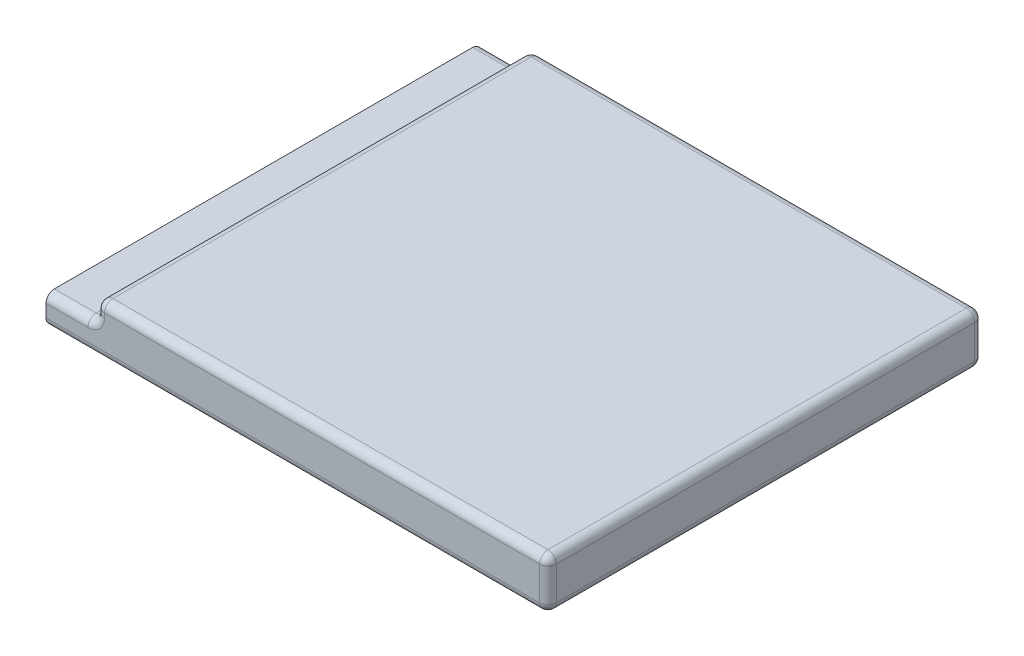
ISO-10303-21;
HEADER;
FILE_DESCRIPTION(('STEP AP214'),'2;1');
FILE_NAME('part.step','',(''),(''),'','','');
FILE_SCHEMA(('AUTOMOTIVE_DESIGN { 1 0 10303 214 1 1 1 1 }'));
ENDSEC;
DATA;
#1=APPLICATION_CONTEXT('core data for automotive mechanical design processes');
#2=APPLICATION_PROTOCOL_DEFINITION('international standard','automotive_design',2000,#1);
#3=PRODUCT_CONTEXT('',#1,'mechanical');
#4=PRODUCT('Part','Part','',(#3));
#5=PRODUCT_RELATED_PRODUCT_CATEGORY('part','',(#4));
#6=PRODUCT_DEFINITION_FORMATION('','',#4);
#7=PRODUCT_DEFINITION_CONTEXT('part definition',#1,'design');
#8=PRODUCT_DEFINITION('design','',#6,#7);
#9=PRODUCT_DEFINITION_SHAPE('','',#8);
#10=(LENGTH_UNIT() NAMED_UNIT(*) SI_UNIT(.MILLI.,.METRE.));
#11=(NAMED_UNIT(*) PLANE_ANGLE_UNIT() SI_UNIT($,.RADIAN.));
#12=(NAMED_UNIT(*) SI_UNIT($,.STERADIAN.) SOLID_ANGLE_UNIT());
#13=UNCERTAINTY_MEASURE_WITH_UNIT(LENGTH_MEASURE(1.E-05),#10,'distance_accuracy_value','');
#14=(GEOMETRIC_REPRESENTATION_CONTEXT(3) GLOBAL_UNCERTAINTY_ASSIGNED_CONTEXT((#13)) GLOBAL_UNIT_ASSIGNED_CONTEXT((#10,
#11,#12)) REPRESENTATION_CONTEXT('',''));
#15=CARTESIAN_POINT('',(0.,0.,0.));
#16=DIRECTION('',(0.,0.,1.));
#17=DIRECTION('',(1.,0.,0.));
#18=AXIS2_PLACEMENT_3D('',#15,#16,#17);
#19=CARTESIAN_POINT('',(-18.8789422844798,6.,-20.4763912470127));
#20=DIRECTION('',(1.,0.,0.));
#21=DIRECTION('',(0.,0.,-1.));
#22=AXIS2_PLACEMENT_3D('',#19,#20,#21);
#23=PLANE('',#22);
#24=DIRECTION('',(0.,-1.,0.));
#25=VECTOR('',#24,1.);
#26=CARTESIAN_POINT('',(-18.8789422844798,6.,31.5236087529873));
#27=LINE('',#26,#25);
#28=CARTESIAN_POINT('',(-18.8789422844798,2.5,31.5236087529873));
#29=VERTEX_POINT('',#28);
#30=CARTESIAN_POINT('',(-18.8789422844798,1.,31.5236087529873));
#31=VERTEX_POINT('',#30);
#32=EDGE_CURVE('E307',#29,#31,#27,.T.);
#33=ORIENTED_EDGE('',*,*,#32,.F.);
#34=CARTESIAN_POINT('',(-18.8789422844798,2.5,30.5236087529873));
#35=DIRECTION('',(1.,0.,0.));
#36=DIRECTION('',(0.,0.,-1.));
#37=AXIS2_PLACEMENT_3D('',#34,#35,#36);
#38=CIRCLE('',#37,1.);
#39=CARTESIAN_POINT('',(-18.8789422844798,3.5,30.5236087529873));
#40=VERTEX_POINT('',#39);
#41=EDGE_CURVE('E171',#29,#40,#38,.F.);
#42=ORIENTED_EDGE('',*,*,#41,.T.);
#43=DIRECTION('',(0.,0.,1.));
#44=VECTOR('',#43,1.);
#45=CARTESIAN_POINT('',(-18.8789422844798,3.5,-20.4763912470127));
#46=LINE('',#45,#44);
#47=CARTESIAN_POINT('',(-18.8789422844798,3.5,-19.4763912470127));
#48=VERTEX_POINT('',#47);
#49=EDGE_CURVE('E155',#48,#40,#46,.T.);
#50=ORIENTED_EDGE('',*,*,#49,.F.);
#51=CARTESIAN_POINT('',(-18.8789422844798,2.5,-19.4763912470127));
#52=DIRECTION('',(1.,0.,0.));
#53=DIRECTION('',(0.,0.,-1.));
#54=AXIS2_PLACEMENT_3D('',#51,#52,#53);
#55=CIRCLE('',#54,1.);
#56=CARTESIAN_POINT('',(-18.8789422844798,2.5,-20.4763912470127));
#57=VERTEX_POINT('',#56);
#58=EDGE_CURVE('E168',#48,#57,#55,.F.);
#59=ORIENTED_EDGE('',*,*,#58,.T.);
#60=DIRECTION('',(0.,-1.,0.));
#61=VECTOR('',#60,1.);
#62=CARTESIAN_POINT('',(-18.8789422844798,6.,-20.4763912470127));
#63=LINE('',#62,#61);
#64=CARTESIAN_POINT('',(-18.8789422844798,1.,-20.4763912470127));
#65=VERTEX_POINT('',#64);
#66=EDGE_CURVE('E304',#57,#65,#63,.T.);
#67=ORIENTED_EDGE('',*,*,#66,.T.);
#68=CARTESIAN_POINT('',(-18.8789422844798,1.,-19.4763912470127));
#69=DIRECTION('',(1.,0.,0.));
#70=DIRECTION('',(0.,0.,-1.));
#71=AXIS2_PLACEMENT_3D('',#68,#69,#70);
#72=CIRCLE('',#71,1.);
#73=CARTESIAN_POINT('',(-18.8789422844798,0.,-19.4763912470127));
#74=VERTEX_POINT('',#73);
#75=EDGE_CURVE('E177',#65,#74,#72,.F.);
#76=ORIENTED_EDGE('',*,*,#75,.T.);
#77=DIRECTION('',(0.,0.,1.));
#78=VECTOR('',#77,1.);
#79=CARTESIAN_POINT('',(-18.8789422844798,0.,-20.4763912470127));
#80=LINE('',#79,#78);
#81=CARTESIAN_POINT('',(-18.8789422844798,0.,30.5236087529873));
#82=VERTEX_POINT('',#81);
#83=EDGE_CURVE('E172',#74,#82,#80,.T.);
#84=ORIENTED_EDGE('',*,*,#83,.T.);
#85=CARTESIAN_POINT('',(-18.8789422844798,1.,30.5236087529873));
#86=DIRECTION('',(1.,0.,0.));
#87=DIRECTION('',(0.,0.,-1.));
#88=AXIS2_PLACEMENT_3D('',#85,#86,#87);
#89=CIRCLE('',#88,1.);
#90=EDGE_CURVE('E181',#82,#31,#89,.F.);
#91=ORIENTED_EDGE('',*,*,#90,.T.);
#92=EDGE_LOOP('',(#33,#42,#50,#59,#67,#76,#84,#91));
#93=FACE_BOUND('',#92,.T.);
#94=ADVANCED_FACE('F33',(#93),#23,.F.);
#95=CARTESIAN_POINT('',(-18.8789422844798,6.,31.5236087529873));
#96=DIRECTION('',(0.,0.,-1.));
#97=DIRECTION('',(-1.,0.,0.));
#98=AXIS2_PLACEMENT_3D('',#95,#96,#97);
#99=PLANE('',#98);
#100=CARTESIAN_POINT('',(-13.8789422844798,4.5,31.5236087529873));
#101=DIRECTION('',(0.,0.,-1.));
#102=DIRECTION('',(-1.,0.,0.));
#103=AXIS2_PLACEMENT_3D('',#100,#101,#102);
#104=CIRCLE('',#103,2.);
#105=CARTESIAN_POINT('',(-13.8789422844798,2.5,31.5236087529873));
#106=VERTEX_POINT('',#105);
#107=CARTESIAN_POINT('',(-11.8789422844798,4.5,31.5236087529873));
#108=VERTEX_POINT('',#107);
#109=EDGE_CURVE('E323',#106,#108,#104,.F.);
#110=ORIENTED_EDGE('',*,*,#109,.F.);
#111=DIRECTION('',(1.,0.,0.));
#112=VECTOR('',#111,1.);
#113=CARTESIAN_POINT('',(-18.8789422844798,2.5,31.5236087529873));
#114=LINE('',#113,#112);
#115=EDGE_CURVE('E326',#106,#29,#114,.F.);
#116=ORIENTED_EDGE('',*,*,#115,.T.);
#117=ORIENTED_EDGE('',*,*,#32,.T.);
#118=DIRECTION('',(1.,0.,0.));
#119=VECTOR('',#118,1.);
#120=CARTESIAN_POINT('',(-18.8789422844798,1.,31.5236087529873));
#121=LINE('',#120,#119);
#122=CARTESIAN_POINT('',(40.1210577155202,1.,31.5236087529873));
#123=VERTEX_POINT('',#122);
#124=EDGE_CURVE('E321',#31,#123,#121,.T.);
#125=ORIENTED_EDGE('',*,*,#124,.T.);
#126=DIRECTION('',(0.,-1.,0.));
#127=VECTOR('',#126,1.);
#128=CARTESIAN_POINT('',(40.1210577155202,6.,31.5236087529873));
#129=LINE('',#128,#127);
#130=CARTESIAN_POINT('',(40.1210577155202,5.,31.5236087529873));
#131=VERTEX_POINT('',#130);
#132=EDGE_CURVE('E319',#123,#131,#129,.F.);
#133=ORIENTED_EDGE('',*,*,#132,.T.);
#134=DIRECTION('',(1.,0.,0.));
#135=VECTOR('',#134,1.);
#136=CARTESIAN_POINT('',(-12.8789422844798,5.,31.5236087529873));
#137=LINE('',#136,#135);
#138=CARTESIAN_POINT('',(-11.8789422844798,5.,31.5236087529873));
#139=VERTEX_POINT('',#138);
#140=EDGE_CURVE('E315',#131,#139,#137,.F.);
#141=ORIENTED_EDGE('',*,*,#140,.T.);
#142=DIRECTION('',(0.,1.,0.));
#143=VECTOR('',#142,1.);
#144=CARTESIAN_POINT('',(-11.8789422844798,6.,31.5236087529873));
#145=LINE('',#144,#143);
#146=EDGE_CURVE('E317',#139,#108,#145,.F.);
#147=ORIENTED_EDGE('',*,*,#146,.T.);
#148=EDGE_LOOP('',(#110,#116,#117,#125,#133,#141,#147));
#149=FACE_BOUND('',#148,.T.);
#150=ADVANCED_FACE('F332',(#149),#99,.F.);
#151=CARTESIAN_POINT('',(41.1210577155202,6.,-20.4763912470127));
#152=DIRECTION('',(-1.,0.,0.));
#153=DIRECTION('',(0.,0.,1.));
#154=AXIS2_PLACEMENT_3D('',#151,#152,#153);
#155=PLANE('',#154);
#156=DIRECTION('',(0.,-1.,0.));
#157=VECTOR('',#156,1.);
#158=CARTESIAN_POINT('',(41.1210577155202,6.,30.5236087529873));
#159=LINE('',#158,#157);
#160=CARTESIAN_POINT('',(41.1210577155202,5.,30.5236087529873));
#161=VERTEX_POINT('',#160);
#162=CARTESIAN_POINT('',(41.1210577155202,1.,30.5236087529873));
#163=VERTEX_POINT('',#162);
#164=EDGE_CURVE('E207',#161,#163,#159,.T.);
#165=ORIENTED_EDGE('',*,*,#164,.T.);
#166=DIRECTION('',(0.,0.,-1.));
#167=VECTOR('',#166,1.);
#168=CARTESIAN_POINT('',(41.1210577155202,1.,-20.4763912470127));
#169=LINE('',#168,#167);
#170=CARTESIAN_POINT('',(41.1210577155202,1.,-19.4763912470127));
#171=VERTEX_POINT('',#170);
#172=EDGE_CURVE('E212',#163,#171,#169,.T.);
#173=ORIENTED_EDGE('',*,*,#172,.T.);
#174=DIRECTION('',(0.,-1.,0.));
#175=VECTOR('',#174,1.);
#176=CARTESIAN_POINT('',(41.1210577155202,6.,-19.4763912470127));
#177=LINE('',#176,#175);
#178=CARTESIAN_POINT('',(41.1210577155202,5.,-19.4763912470127));
#179=VERTEX_POINT('',#178);
#180=EDGE_CURVE('E209',#171,#179,#177,.F.);
#181=ORIENTED_EDGE('',*,*,#180,.T.);
#182=DIRECTION('',(0.,0.,-1.));
#183=VECTOR('',#182,1.);
#184=CARTESIAN_POINT('',(41.1210577155202,5.,31.5236087529873));
#185=LINE('',#184,#183);
#186=EDGE_CURVE('E205',#179,#161,#185,.F.);
#187=ORIENTED_EDGE('',*,*,#186,.T.);
#188=EDGE_LOOP('',(#165,#173,#181,#187));
#189=FACE_BOUND('',#188,.T.);
#190=ADVANCED_FACE('F415',(#189),#155,.F.);
#191=CARTESIAN_POINT('',(-18.8789422844798,6.,-20.4763912470127));
#192=DIRECTION('',(0.,0.,1.));
#193=DIRECTION('',(1.,0.,0.));
#194=AXIS2_PLACEMENT_3D('',#191,#192,#193);
#195=PLANE('',#194);
#196=DIRECTION('',(0.,-1.,0.));
#197=VECTOR('',#196,1.);
#198=CARTESIAN_POINT('',(40.1210577155202,6.,-20.4763912470127));
#199=LINE('',#198,#197);
#200=CARTESIAN_POINT('',(40.1210577155202,5.,-20.4763912470127));
#201=VERTEX_POINT('',#200);
#202=CARTESIAN_POINT('',(40.1210577155202,1.,-20.4763912470127));
#203=VERTEX_POINT('',#202);
#204=EDGE_CURVE('E188',#201,#203,#199,.T.);
#205=ORIENTED_EDGE('',*,*,#204,.T.);
#206=DIRECTION('',(-1.,0.,0.));
#207=VECTOR('',#206,1.);
#208=CARTESIAN_POINT('',(-18.8789422844798,1.,-20.4763912470127));
#209=LINE('',#208,#207);
#210=EDGE_CURVE('E194',#203,#65,#209,.T.);
#211=ORIENTED_EDGE('',*,*,#210,.T.);
#212=ORIENTED_EDGE('',*,*,#66,.F.);
#213=DIRECTION('',(-1.,0.,0.));
#214=VECTOR('',#213,1.);
#215=CARTESIAN_POINT('',(-18.8789422844798,2.5,-20.4763912470127));
#216=LINE('',#215,#214);
#217=CARTESIAN_POINT('',(-13.8789422844798,2.5,-20.4763912470127));
#218=VERTEX_POINT('',#217);
#219=EDGE_CURVE('E176',#57,#218,#216,.F.);
#220=ORIENTED_EDGE('',*,*,#219,.T.);
#221=CARTESIAN_POINT('',(-13.8789422844798,4.5,-20.4763912470127));
#222=DIRECTION('',(0.,0.,1.));
#223=DIRECTION('',(1.,0.,0.));
#224=AXIS2_PLACEMENT_3D('',#221,#222,#223);
#225=CIRCLE('',#224,2.);
#226=CARTESIAN_POINT('',(-11.8789422844798,4.5,-20.4763912470127));
#227=VERTEX_POINT('',#226);
#228=EDGE_CURVE('E190',#227,#218,#225,.F.);
#229=ORIENTED_EDGE('',*,*,#228,.F.);
#230=DIRECTION('',(0.,1.,0.));
#231=VECTOR('',#230,1.);
#232=CARTESIAN_POINT('',(-11.8789422844798,6.,-20.4763912470127));
#233=LINE('',#232,#231);
#234=CARTESIAN_POINT('',(-11.8789422844798,5.,-20.4763912470127));
#235=VERTEX_POINT('',#234);
#236=EDGE_CURVE('E186',#227,#235,#233,.T.);
#237=ORIENTED_EDGE('',*,*,#236,.T.);
#238=DIRECTION('',(-1.,0.,0.));
#239=VECTOR('',#238,1.);
#240=CARTESIAN_POINT('',(41.1210577155202,5.,-20.4763912470127));
#241=LINE('',#240,#239);
#242=EDGE_CURVE('E179',#235,#201,#241,.F.);
#243=ORIENTED_EDGE('',*,*,#242,.T.);
#244=EDGE_LOOP('',(#205,#211,#212,#220,#229,#237,#243));
#245=FACE_BOUND('',#244,.T.);
#246=ADVANCED_FACE('F303',(#245),#195,.F.);
#247=CARTESIAN_POINT('',(0.,6.,0.));
#248=DIRECTION('',(0.,1.,0.));
#249=DIRECTION('',(0.,0.,1.));
#250=AXIS2_PLACEMENT_3D('',#247,#248,#249);
#251=PLANE('',#250);
#252=DIRECTION('',(1.,0.,0.));
#253=VECTOR('',#252,1.);
#254=CARTESIAN_POINT('',(41.1210577155202,6.,30.5236087529873));
#255=LINE('',#254,#253);
#256=CARTESIAN_POINT('',(-11.8789422844798,6.,30.5236087529873));
#257=VERTEX_POINT('',#256);
#258=CARTESIAN_POINT('',(40.1210577155202,6.,30.5236087529873));
#259=VERTEX_POINT('',#258);
#260=EDGE_CURVE('E220',#257,#259,#255,.T.);
#261=ORIENTED_EDGE('',*,*,#260,.T.);
#262=DIRECTION('',(0.,0.,-1.));
#263=VECTOR('',#262,1.);
#264=CARTESIAN_POINT('',(40.1210577155202,6.,-20.4763912470127));
#265=LINE('',#264,#263);
#266=CARTESIAN_POINT('',(40.1210577155202,6.,-19.4763912470127));
#267=VERTEX_POINT('',#266);
#268=EDGE_CURVE('E11',#259,#267,#265,.T.);
#269=ORIENTED_EDGE('',*,*,#268,.T.);
#270=DIRECTION('',(-1.,0.,0.));
#271=VECTOR('',#270,1.);
#272=CARTESIAN_POINT('',(-12.8789422844798,6.,-19.4763912470127));
#273=LINE('',#272,#271);
#274=CARTESIAN_POINT('',(-11.8789422844798,6.,-19.4763912470127));
#275=VERTEX_POINT('',#274);
#276=EDGE_CURVE('E42',#267,#275,#273,.T.);
#277=ORIENTED_EDGE('',*,*,#276,.T.);
#278=DIRECTION('',(0.,0.,-1.));
#279=VECTOR('',#278,1.);
#280=CARTESIAN_POINT('',(-11.8789422844798,6.,31.5236087529873));
#281=LINE('',#280,#279);
#282=EDGE_CURVE('E222',#275,#257,#281,.F.);
#283=ORIENTED_EDGE('',*,*,#282,.T.);
#284=EDGE_LOOP('',(#261,#269,#277,#283));
#285=FACE_BOUND('',#284,.T.);
#286=ADVANCED_FACE('F393',(#285),#251,.T.);
#287=CARTESIAN_POINT('',(0.,0.,0.));
#288=DIRECTION('',(0.,1.,0.));
#289=DIRECTION('',(0.,0.,1.));
#290=AXIS2_PLACEMENT_3D('',#287,#288,#289);
#291=PLANE('',#290);
#292=ORIENTED_EDGE('',*,*,#83,.F.);
#293=DIRECTION('',(-1.,0.,0.));
#294=VECTOR('',#293,1.);
#295=CARTESIAN_POINT('',(0.,0.,-19.4763912470127));
#296=LINE('',#295,#294);
#297=CARTESIAN_POINT('',(40.1210577155202,0.,-19.4763912470127));
#298=VERTEX_POINT('',#297);
#299=EDGE_CURVE('E218',#74,#298,#296,.F.);
#300=ORIENTED_EDGE('',*,*,#299,.T.);
#301=DIRECTION('',(0.,0.,-1.));
#302=VECTOR('',#301,1.);
#303=CARTESIAN_POINT('',(40.1210577155202,0.,0.));
#304=LINE('',#303,#302);
#305=CARTESIAN_POINT('',(40.1210577155202,0.,30.5236087529873));
#306=VERTEX_POINT('',#305);
#307=EDGE_CURVE('E216',#298,#306,#304,.F.);
#308=ORIENTED_EDGE('',*,*,#307,.T.);
#309=DIRECTION('',(1.,0.,0.));
#310=VECTOR('',#309,1.);
#311=CARTESIAN_POINT('',(0.,0.,30.5236087529873));
#312=LINE('',#311,#310);
#313=EDGE_CURVE('E214',#306,#82,#312,.F.);
#314=ORIENTED_EDGE('',*,*,#313,.T.);
#315=EDGE_LOOP('',(#292,#300,#308,#314));
#316=FACE_BOUND('',#315,.T.);
#317=ADVANCED_FACE('F400',(#316),#291,.F.);
#318=CARTESIAN_POINT('',(-12.8789422844798,3.5,-20.4763912470127));
#319=DIRECTION('',(1.,0.,0.));
#320=DIRECTION('',(0.,0.,-1.));
#321=AXIS2_PLACEMENT_3D('',#318,#319,#320);
#322=PLANE('',#321);
#323=DIRECTION('',(0.,1.,0.));
#324=VECTOR('',#323,1.);
#325=CARTESIAN_POINT('',(-12.8789422844798,3.5,-19.4763912470127));
#326=LINE('',#325,#324);
#327=CARTESIAN_POINT('',(-12.8789422844798,5.,-19.4763912470127));
#328=VERTEX_POINT('',#327);
#329=CARTESIAN_POINT('',(-12.8789422844798,4.5,-19.4763912470127));
#330=VERTEX_POINT('',#329);
#331=EDGE_CURVE('E198',#328,#330,#326,.F.);
#332=ORIENTED_EDGE('',*,*,#331,.T.);
#333=DIRECTION('',(0.,0.,-1.));
#334=VECTOR('',#333,1.);
#335=CARTESIAN_POINT('',(-12.8789422844798,4.5,31.5236087529873));
#336=LINE('',#335,#334);
#337=CARTESIAN_POINT('',(-12.8789422844798,4.5,30.5236087529873));
#338=VERTEX_POINT('',#337);
#339=EDGE_CURVE('E202',#330,#338,#336,.F.);
#340=ORIENTED_EDGE('',*,*,#339,.T.);
#341=DIRECTION('',(0.,1.,0.));
#342=VECTOR('',#341,1.);
#343=CARTESIAN_POINT('',(-12.8789422844798,3.5,30.5236087529873));
#344=LINE('',#343,#342);
#345=CARTESIAN_POINT('',(-12.8789422844798,5.,30.5236087529873));
#346=VERTEX_POINT('',#345);
#347=EDGE_CURVE('E200',#338,#346,#344,.T.);
#348=ORIENTED_EDGE('',*,*,#347,.T.);
#349=DIRECTION('',(0.,0.,-1.));
#350=VECTOR('',#349,1.);
#351=CARTESIAN_POINT('',(-12.8789422844798,5.,-20.4763912470127));
#352=LINE('',#351,#350);
#353=EDGE_CURVE('E196',#346,#328,#352,.T.);
#354=ORIENTED_EDGE('',*,*,#353,.T.);
#355=EDGE_LOOP('',(#332,#340,#348,#354));
#356=FACE_BOUND('',#355,.T.);
#357=ADVANCED_FACE('F398',(#356),#322,.F.);
#358=CARTESIAN_POINT('',(0.,3.5,0.));
#359=DIRECTION('',(0.,-1.,0.));
#360=DIRECTION('',(0.,0.,-1.));
#361=AXIS2_PLACEMENT_3D('',#358,#359,#360);
#362=PLANE('',#361);
#363=ORIENTED_EDGE('',*,*,#49,.T.);
#364=DIRECTION('',(1.,0.,0.));
#365=VECTOR('',#364,1.);
#366=CARTESIAN_POINT('',(0.,3.5,30.5236087529873));
#367=LINE('',#366,#365);
#368=CARTESIAN_POINT('',(-13.8789422844798,3.5,30.5236087529873));
#369=VERTEX_POINT('',#368);
#370=EDGE_CURVE('E163',#40,#369,#367,.T.);
#371=ORIENTED_EDGE('',*,*,#370,.T.);
#372=DIRECTION('',(0.,0.,-1.));
#373=VECTOR('',#372,1.);
#374=CARTESIAN_POINT('',(-13.8789422844798,3.5,-20.4763912470127));
#375=LINE('',#374,#373);
#376=CARTESIAN_POINT('',(-13.8789422844798,3.5,-19.4763912470127));
#377=VERTEX_POINT('',#376);
#378=EDGE_CURVE('E158',#369,#377,#375,.T.);
#379=ORIENTED_EDGE('',*,*,#378,.T.);
#380=DIRECTION('',(-1.,0.,0.));
#381=VECTOR('',#380,1.);
#382=CARTESIAN_POINT('',(0.,3.5,-19.4763912470127));
#383=LINE('',#382,#381);
#384=EDGE_CURVE('E151',#377,#48,#383,.T.);
#385=ORIENTED_EDGE('',*,*,#384,.T.);
#386=EDGE_LOOP('',(#363,#371,#379,#385));
#387=FACE_BOUND('',#386,.T.);
#388=ADVANCED_FACE('F153',(#387),#362,.F.);
#389=CARTESIAN_POINT('',(-18.8789422844798,1.,-19.4763912470127));
#390=DIRECTION('',(-1.,0.,0.));
#391=DIRECTION('',(0.,0.,1.));
#392=AXIS2_PLACEMENT_3D('',#389,#390,#391);
#393=CYLINDRICAL_SURFACE('',#392,1.);
#394=CARTESIAN_POINT('',(40.1210577155202,1.,-19.4763912470127));
#395=DIRECTION('',(1.,0.,0.));
#396=DIRECTION('',(0.,0.,-1.));
#397=AXIS2_PLACEMENT_3D('',#394,#395,#396);
#398=CIRCLE('',#397,1.);
#399=EDGE_CURVE('E37',#298,#203,#398,.T.);
#400=ORIENTED_EDGE('',*,*,#399,.F.);
#401=ORIENTED_EDGE('',*,*,#299,.F.);
#402=ORIENTED_EDGE('',*,*,#75,.F.);
#403=ORIENTED_EDGE('',*,*,#210,.F.);
#404=EDGE_LOOP('',(#400,#401,#402,#403));
#405=FACE_BOUND('',#404,.T.);
#406=ADVANCED_FACE('F35',(#405),#393,.T.);
#407=CARTESIAN_POINT('',(40.1210577155202,1.,-19.4763912470127));
#408=DIRECTION('',(0.,0.,1.));
#409=DIRECTION('',(1.,0.,0.));
#410=AXIS2_PLACEMENT_3D('',#407,#408,#409);
#411=SPHERICAL_SURFACE('',#410,1.);
#412=CARTESIAN_POINT('',(40.1210577155202,1.,-19.4763912470127));
#413=DIRECTION('',(0.,0.,-1.));
#414=DIRECTION('',(-1.,0.,0.));
#415=AXIS2_PLACEMENT_3D('',#412,#413,#414);
#416=CIRCLE('',#415,1.);
#417=EDGE_CURVE('E284',#298,#171,#416,.F.);
#418=ORIENTED_EDGE('',*,*,#417,.F.);
#419=ORIENTED_EDGE('',*,*,#399,.T.);
#420=CARTESIAN_POINT('',(40.1210577155202,1.,-19.4763912470127));
#421=DIRECTION('',(0.,-1.,0.));
#422=DIRECTION('',(0.,0.,-1.));
#423=AXIS2_PLACEMENT_3D('',#420,#421,#422);
#424=CIRCLE('',#423,1.);
#425=EDGE_CURVE('E286',#171,#203,#424,.F.);
#426=ORIENTED_EDGE('',*,*,#425,.F.);
#427=EDGE_LOOP('',(#418,#419,#426));
#428=FACE_BOUND('',#427,.T.);
#429=ADVANCED_FACE('F296',(#428),#411,.T.);
#430=CARTESIAN_POINT('',(40.1210577155202,6.,-19.4763912470127));
#431=DIRECTION('',(0.,-1.,0.));
#432=DIRECTION('',(0.,0.,-1.));
#433=AXIS2_PLACEMENT_3D('',#430,#431,#432);
#434=CYLINDRICAL_SURFACE('',#433,1.);
#435=ORIENTED_EDGE('',*,*,#425,.T.);
#436=ORIENTED_EDGE('',*,*,#204,.F.);
#437=CARTESIAN_POINT('',(40.1210577155202,5.,-19.4763912470127));
#438=DIRECTION('',(0.,1.,0.));
#439=DIRECTION('',(0.,0.,1.));
#440=AXIS2_PLACEMENT_3D('',#437,#438,#439);
#441=CIRCLE('',#440,1.);
#442=EDGE_CURVE('E281',#179,#201,#441,.T.);
#443=ORIENTED_EDGE('',*,*,#442,.F.);
#444=ORIENTED_EDGE('',*,*,#180,.F.);
#445=EDGE_LOOP('',(#435,#436,#443,#444));
#446=FACE_BOUND('',#445,.T.);
#447=ADVANCED_FACE('F385',(#446),#434,.T.);
#448=CARTESIAN_POINT('',(40.1210577155202,1.,-20.4763912470127));
#449=DIRECTION('',(0.,0.,-1.));
#450=DIRECTION('',(-1.,0.,0.));
#451=AXIS2_PLACEMENT_3D('',#448,#449,#450);
#452=CYLINDRICAL_SURFACE('',#451,1.);
#453=ORIENTED_EDGE('',*,*,#417,.T.);
#454=ORIENTED_EDGE('',*,*,#172,.F.);
#455=CARTESIAN_POINT('',(40.1210577155202,1.,30.5236087529873));
#456=DIRECTION('',(0.,0.,1.));
#457=DIRECTION('',(1.,0.,0.));
#458=AXIS2_PLACEMENT_3D('',#455,#456,#457);
#459=CIRCLE('',#458,1.);
#460=EDGE_CURVE('E278',#306,#163,#459,.T.);
#461=ORIENTED_EDGE('',*,*,#460,.F.);
#462=ORIENTED_EDGE('',*,*,#307,.F.);
#463=EDGE_LOOP('',(#453,#454,#461,#462));
#464=FACE_BOUND('',#463,.T.);
#465=ADVANCED_FACE('F457',(#464),#452,.T.);
#466=CARTESIAN_POINT('',(-18.8789422844798,1.,30.5236087529873));
#467=DIRECTION('',(1.,0.,0.));
#468=DIRECTION('',(0.,0.,-1.));
#469=AXIS2_PLACEMENT_3D('',#466,#467,#468);
#470=CYLINDRICAL_SURFACE('',#469,1.);
#471=ORIENTED_EDGE('',*,*,#90,.F.);
#472=ORIENTED_EDGE('',*,*,#313,.F.);
#473=CARTESIAN_POINT('',(40.1210577155202,1.,30.5236087529873));
#474=DIRECTION('',(1.,0.,0.));
#475=DIRECTION('',(0.,0.,-1.));
#476=AXIS2_PLACEMENT_3D('',#473,#474,#475);
#477=CIRCLE('',#476,1.);
#478=EDGE_CURVE('E275',#123,#306,#477,.T.);
#479=ORIENTED_EDGE('',*,*,#478,.F.);
#480=ORIENTED_EDGE('',*,*,#124,.F.);
#481=EDGE_LOOP('',(#471,#472,#479,#480));
#482=FACE_BOUND('',#481,.T.);
#483=ADVANCED_FACE('F335',(#482),#470,.T.);
#484=CARTESIAN_POINT('',(40.1210577155202,5.,-19.4763912470127));
#485=DIRECTION('',(0.,0.,1.));
#486=DIRECTION('',(1.,0.,0.));
#487=AXIS2_PLACEMENT_3D('',#484,#485,#486);
#488=SPHERICAL_SURFACE('',#487,1.);
#489=CARTESIAN_POINT('',(40.1210577155202,5.,-19.4763912470127));
#490=DIRECTION('',(0.,0.,-1.));
#491=DIRECTION('',(-1.,0.,0.));
#492=AXIS2_PLACEMENT_3D('',#489,#490,#491);
#493=CIRCLE('',#492,1.);
#494=EDGE_CURVE('E270',#179,#267,#493,.F.);
#495=ORIENTED_EDGE('',*,*,#494,.F.);
#496=ORIENTED_EDGE('',*,*,#442,.T.);
#497=CARTESIAN_POINT('',(40.1210577155202,5.,-19.4763912470127));
#498=DIRECTION('',(1.,0.,0.));
#499=DIRECTION('',(0.,0.,-1.));
#500=AXIS2_PLACEMENT_3D('',#497,#498,#499);
#501=CIRCLE('',#500,1.);
#502=EDGE_CURVE('E273',#267,#201,#501,.F.);
#503=ORIENTED_EDGE('',*,*,#502,.F.);
#504=EDGE_LOOP('',(#495,#496,#503));
#505=FACE_BOUND('',#504,.T.);
#506=ADVANCED_FACE('F388',(#505),#488,.T.);
#507=CARTESIAN_POINT('',(40.1210577155202,1.,30.5236087529873));
#508=DIRECTION('',(0.,0.,1.));
#509=DIRECTION('',(1.,0.,0.));
#510=AXIS2_PLACEMENT_3D('',#507,#508,#509);
#511=SPHERICAL_SURFACE('',#510,1.);
#512=ORIENTED_EDGE('',*,*,#478,.T.);
#513=ORIENTED_EDGE('',*,*,#460,.T.);
#514=CARTESIAN_POINT('',(40.1210577155202,1.,30.5236087529873));
#515=DIRECTION('',(0.,-1.,0.));
#516=DIRECTION('',(0.,0.,-1.));
#517=AXIS2_PLACEMENT_3D('',#514,#515,#516);
#518=CIRCLE('',#517,1.);
#519=EDGE_CURVE('E267',#123,#163,#518,.F.);
#520=ORIENTED_EDGE('',*,*,#519,.F.);
#521=EDGE_LOOP('',(#512,#513,#520));
#522=FACE_BOUND('',#521,.T.);
#523=ADVANCED_FACE('F340',(#522),#511,.T.);
#524=CARTESIAN_POINT('',(0.,5.,-19.4763912470127));
#525=DIRECTION('',(1.,0.,0.));
#526=DIRECTION('',(0.,0.,-1.));
#527=AXIS2_PLACEMENT_3D('',#524,#525,#526);
#528=CYLINDRICAL_SURFACE('',#527,1.);
#529=ORIENTED_EDGE('',*,*,#502,.T.);
#530=ORIENTED_EDGE('',*,*,#242,.F.);
#531=CARTESIAN_POINT('',(-11.8789422844798,5.,-19.4763912470127));
#532=DIRECTION('',(-1.,0.,0.));
#533=DIRECTION('',(0.,0.,1.));
#534=AXIS2_PLACEMENT_3D('',#531,#532,#533);
#535=CIRCLE('',#534,1.);
#536=EDGE_CURVE('E264',#275,#235,#535,.T.);
#537=ORIENTED_EDGE('',*,*,#536,.F.);
#538=ORIENTED_EDGE('',*,*,#276,.F.);
#539=EDGE_LOOP('',(#529,#530,#537,#538));
#540=FACE_BOUND('',#539,.T.);
#541=ADVANCED_FACE('F383',(#540),#528,.T.);
#542=CARTESIAN_POINT('',(40.1210577155202,5.,0.));
#543=DIRECTION('',(0.,0.,1.));
#544=DIRECTION('',(1.,0.,0.));
#545=AXIS2_PLACEMENT_3D('',#542,#543,#544);
#546=CYLINDRICAL_SURFACE('',#545,1.);
#547=ORIENTED_EDGE('',*,*,#494,.T.);
#548=ORIENTED_EDGE('',*,*,#268,.F.);
#549=CARTESIAN_POINT('',(40.1210577155202,5.,30.5236087529873));
#550=DIRECTION('',(0.,0.,1.));
#551=DIRECTION('',(1.,0.,0.));
#552=AXIS2_PLACEMENT_3D('',#549,#550,#551);
#553=CIRCLE('',#552,1.);
#554=EDGE_CURVE('E261',#161,#259,#553,.T.);
#555=ORIENTED_EDGE('',*,*,#554,.F.);
#556=ORIENTED_EDGE('',*,*,#186,.F.);
#557=EDGE_LOOP('',(#547,#548,#555,#556));
#558=FACE_BOUND('',#557,.T.);
#559=ADVANCED_FACE('F391',(#558),#546,.T.);
#560=CARTESIAN_POINT('',(40.1210577155202,6.,30.5236087529873));
#561=DIRECTION('',(0.,-1.,0.));
#562=DIRECTION('',(0.,0.,-1.));
#563=AXIS2_PLACEMENT_3D('',#560,#561,#562);
#564=CYLINDRICAL_SURFACE('',#563,1.);
#565=ORIENTED_EDGE('',*,*,#519,.T.);
#566=ORIENTED_EDGE('',*,*,#164,.F.);
#567=CARTESIAN_POINT('',(40.1210577155202,5.,30.5236087529873));
#568=DIRECTION('',(0.,1.,0.));
#569=DIRECTION('',(0.,0.,1.));
#570=AXIS2_PLACEMENT_3D('',#567,#568,#569);
#571=CIRCLE('',#570,1.);
#572=EDGE_CURVE('E258',#131,#161,#571,.T.);
#573=ORIENTED_EDGE('',*,*,#572,.F.);
#574=ORIENTED_EDGE('',*,*,#132,.F.);
#575=EDGE_LOOP('',(#565,#566,#573,#574));
#576=FACE_BOUND('',#575,.T.);
#577=ADVANCED_FACE('F344',(#576),#564,.T.);
#578=CARTESIAN_POINT('',(-11.8789422844798,5.,-19.4763912470127));
#579=DIRECTION('',(0.,0.,1.));
#580=DIRECTION('',(1.,0.,0.));
#581=AXIS2_PLACEMENT_3D('',#578,#579,#580);
#582=SPHERICAL_SURFACE('',#581,1.);
#583=CARTESIAN_POINT('',(-11.8789422844798,5.,-19.4763912470127));
#584=DIRECTION('',(0.,0.,-1.));
#585=DIRECTION('',(-1.,0.,0.));
#586=AXIS2_PLACEMENT_3D('',#583,#584,#585);
#587=CIRCLE('',#586,1.);
#588=EDGE_CURVE('E252',#275,#328,#587,.F.);
#589=ORIENTED_EDGE('',*,*,#588,.F.);
#590=ORIENTED_EDGE('',*,*,#536,.T.);
#591=CARTESIAN_POINT('',(-11.8789422844798,5.,-19.4763912470127));
#592=DIRECTION('',(0.,1.,0.));
#593=DIRECTION('',(0.,0.,1.));
#594=AXIS2_PLACEMENT_3D('',#591,#592,#593);
#595=CIRCLE('',#594,1.);
#596=EDGE_CURVE('E255',#328,#235,#595,.F.);
#597=ORIENTED_EDGE('',*,*,#596,.F.);
#598=EDGE_LOOP('',(#589,#590,#597));
#599=FACE_BOUND('',#598,.T.);
#600=ADVANCED_FACE('F381',(#599),#582,.T.);
#601=CARTESIAN_POINT('',(40.1210577155202,5.,30.5236087529873));
#602=DIRECTION('',(0.,0.,1.));
#603=DIRECTION('',(1.,0.,0.));
#604=AXIS2_PLACEMENT_3D('',#601,#602,#603);
#605=SPHERICAL_SURFACE('',#604,1.);
#606=ORIENTED_EDGE('',*,*,#572,.T.);
#607=ORIENTED_EDGE('',*,*,#554,.T.);
#608=CARTESIAN_POINT('',(40.1210577155202,5.,30.5236087529873));
#609=DIRECTION('',(1.,0.,0.));
#610=DIRECTION('',(0.,0.,-1.));
#611=AXIS2_PLACEMENT_3D('',#608,#609,#610);
#612=CIRCLE('',#611,1.);
#613=EDGE_CURVE('E249',#131,#259,#612,.F.);
#614=ORIENTED_EDGE('',*,*,#613,.F.);
#615=EDGE_LOOP('',(#606,#607,#614));
#616=FACE_BOUND('',#615,.T.);
#617=ADVANCED_FACE('F439',(#616),#605,.T.);
#618=CARTESIAN_POINT('',(0.,2.5,-19.4763912470127));
#619=DIRECTION('',(-1.,0.,0.));
#620=DIRECTION('',(0.,0.,1.));
#621=AXIS2_PLACEMENT_3D('',#618,#619,#620);
#622=CYLINDRICAL_SURFACE('',#621,1.);
#623=ORIENTED_EDGE('',*,*,#58,.F.);
#624=ORIENTED_EDGE('',*,*,#384,.F.);
#625=CARTESIAN_POINT('',(-13.8789422844798,2.5,-19.4763912470127));
#626=DIRECTION('',(1.,0.,0.));
#627=DIRECTION('',(0.,0.,-1.));
#628=AXIS2_PLACEMENT_3D('',#625,#626,#627);
#629=CIRCLE('',#628,1.);
#630=EDGE_CURVE('E247',#218,#377,#629,.T.);
#631=ORIENTED_EDGE('',*,*,#630,.F.);
#632=ORIENTED_EDGE('',*,*,#219,.F.);
#633=EDGE_LOOP('',(#623,#624,#631,#632));
#634=FACE_BOUND('',#633,.T.);
#635=ADVANCED_FACE('F175',(#634),#622,.T.);
#636=CARTESIAN_POINT('',(-11.8789422844798,6.,-19.4763912470127));
#637=DIRECTION('',(0.,1.,0.));
#638=DIRECTION('',(0.,0.,1.));
#639=AXIS2_PLACEMENT_3D('',#636,#637,#638);
#640=CYLINDRICAL_SURFACE('',#639,1.);
#641=ORIENTED_EDGE('',*,*,#596,.T.);
#642=ORIENTED_EDGE('',*,*,#236,.F.);
#643=CARTESIAN_POINT('',(-11.8789422844798,4.5,-19.4763912470127));
#644=DIRECTION('',(0.,-1.,0.));
#645=DIRECTION('',(0.,0.,-1.));
#646=AXIS2_PLACEMENT_3D('',#643,#644,#645);
#647=CIRCLE('',#646,1.);
#648=EDGE_CURVE('E244',#330,#227,#647,.T.);
#649=ORIENTED_EDGE('',*,*,#648,.F.);
#650=ORIENTED_EDGE('',*,*,#331,.F.);
#651=EDGE_LOOP('',(#641,#642,#649,#650));
#652=FACE_BOUND('',#651,.T.);
#653=ADVANCED_FACE('F376',(#652),#640,.T.);
#654=CARTESIAN_POINT('',(-11.8789422844798,5.,-20.4763912470127));
#655=DIRECTION('',(0.,0.,1.));
#656=DIRECTION('',(1.,0.,0.));
#657=AXIS2_PLACEMENT_3D('',#654,#655,#656);
#658=CYLINDRICAL_SURFACE('',#657,1.);
#659=ORIENTED_EDGE('',*,*,#588,.T.);
#660=ORIENTED_EDGE('',*,*,#353,.F.);
#661=CARTESIAN_POINT('',(-11.8789422844798,5.,30.5236087529873));
#662=DIRECTION('',(0.,0.,1.));
#663=DIRECTION('',(1.,0.,0.));
#664=AXIS2_PLACEMENT_3D('',#661,#662,#663);
#665=CIRCLE('',#664,1.);
#666=EDGE_CURVE('E241',#257,#346,#665,.T.);
#667=ORIENTED_EDGE('',*,*,#666,.F.);
#668=ORIENTED_EDGE('',*,*,#282,.F.);
#669=EDGE_LOOP('',(#659,#660,#667,#668));
#670=FACE_BOUND('',#669,.T.);
#671=ADVANCED_FACE('F395',(#670),#658,.T.);
#672=CARTESIAN_POINT('',(0.,5.,30.5236087529873));
#673=DIRECTION('',(-1.,0.,0.));
#674=DIRECTION('',(0.,0.,1.));
#675=AXIS2_PLACEMENT_3D('',#672,#673,#674);
#676=CYLINDRICAL_SURFACE('',#675,1.);
#677=ORIENTED_EDGE('',*,*,#613,.T.);
#678=ORIENTED_EDGE('',*,*,#260,.F.);
#679=CARTESIAN_POINT('',(-11.8789422844798,5.,30.5236087529873));
#680=DIRECTION('',(-1.,0.,0.));
#681=DIRECTION('',(0.,0.,1.));
#682=AXIS2_PLACEMENT_3D('',#679,#680,#681);
#683=CIRCLE('',#682,1.);
#684=EDGE_CURVE('E238',#139,#257,#683,.T.);
#685=ORIENTED_EDGE('',*,*,#684,.F.);
#686=ORIENTED_EDGE('',*,*,#140,.F.);
#687=EDGE_LOOP('',(#677,#678,#685,#686));
#688=FACE_BOUND('',#687,.T.);
#689=ADVANCED_FACE('F353',(#688),#676,.T.);
#690=CARTESIAN_POINT('',(-13.8789422844798,4.5,-19.4763912470127));
#691=DIRECTION('',(0.,0.,1.));
#692=DIRECTION('',(1.,0.,0.));
#693=AXIS2_PLACEMENT_3D('',#690,#691,#692);
#694=TOROIDAL_SURFACE('',#693,2.,1.);
#695=ORIENTED_EDGE('',*,*,#228,.T.);
#696=ORIENTED_EDGE('',*,*,#630,.T.);
#697=CARTESIAN_POINT('',(-13.8789422844798,4.5,-19.4763912470127));
#698=DIRECTION('',(0.,0.,1.));
#699=DIRECTION('',(1.,0.,0.));
#700=AXIS2_PLACEMENT_3D('',#697,#698,#699);
#701=CIRCLE('',#700,1.);
#702=EDGE_CURVE('E235',#330,#377,#701,.F.);
#703=ORIENTED_EDGE('',*,*,#702,.F.);
#704=ORIENTED_EDGE('',*,*,#648,.T.);
#705=EDGE_LOOP('',(#695,#696,#703,#704));
#706=FACE_BOUND('',#705,.T.);
#707=ADVANCED_FACE('F371',(#706),#694,.T.);
#708=CARTESIAN_POINT('',(-11.8789422844798,5.,30.5236087529873));
#709=DIRECTION('',(0.,0.,1.));
#710=DIRECTION('',(1.,0.,0.));
#711=AXIS2_PLACEMENT_3D('',#708,#709,#710);
#712=SPHERICAL_SURFACE('',#711,1.);
#713=ORIENTED_EDGE('',*,*,#684,.T.);
#714=ORIENTED_EDGE('',*,*,#666,.T.);
#715=CARTESIAN_POINT('',(-11.8789422844798,5.,30.5236087529873));
#716=DIRECTION('',(0.,1.,0.));
#717=DIRECTION('',(0.,0.,1.));
#718=AXIS2_PLACEMENT_3D('',#715,#716,#717);
#719=CIRCLE('',#718,1.);
#720=EDGE_CURVE('E232',#139,#346,#719,.F.);
#721=ORIENTED_EDGE('',*,*,#720,.F.);
#722=EDGE_LOOP('',(#713,#714,#721));
#723=FACE_BOUND('',#722,.T.);
#724=ADVANCED_FACE('F356',(#723),#712,.T.);
#725=CARTESIAN_POINT('',(-13.8789422844798,4.5,0.));
#726=DIRECTION('',(0.,0.,1.));
#727=DIRECTION('',(1.,0.,0.));
#728=AXIS2_PLACEMENT_3D('',#725,#726,#727);
#729=CYLINDRICAL_SURFACE('',#728,1.);
#730=ORIENTED_EDGE('',*,*,#702,.T.);
#731=ORIENTED_EDGE('',*,*,#378,.F.);
#732=CARTESIAN_POINT('',(-13.8789422844798,4.5,30.5236087529873));
#733=DIRECTION('',(0.,0.,-1.));
#734=DIRECTION('',(-1.,0.,0.));
#735=AXIS2_PLACEMENT_3D('',#732,#733,#734);
#736=CIRCLE('',#735,1.);
#737=EDGE_CURVE('E229',#338,#369,#736,.T.);
#738=ORIENTED_EDGE('',*,*,#737,.F.);
#739=ORIENTED_EDGE('',*,*,#339,.F.);
#740=EDGE_LOOP('',(#730,#731,#738,#739));
#741=FACE_BOUND('',#740,.T.);
#742=ADVANCED_FACE('F368',(#741),#729,.F.);
#743=CARTESIAN_POINT('',(-11.8789422844798,3.5,30.5236087529873));
#744=DIRECTION('',(0.,1.,0.));
#745=DIRECTION('',(0.,0.,1.));
#746=AXIS2_PLACEMENT_3D('',#743,#744,#745);
#747=CYLINDRICAL_SURFACE('',#746,1.);
#748=ORIENTED_EDGE('',*,*,#720,.T.);
#749=ORIENTED_EDGE('',*,*,#347,.F.);
#750=CARTESIAN_POINT('',(-11.8789422844798,4.5,30.5236087529873));
#751=DIRECTION('',(0.,-1.,0.));
#752=DIRECTION('',(0.,0.,-1.));
#753=AXIS2_PLACEMENT_3D('',#750,#751,#752);
#754=CIRCLE('',#753,1.);
#755=EDGE_CURVE('E227',#108,#338,#754,.T.);
#756=ORIENTED_EDGE('',*,*,#755,.F.);
#757=ORIENTED_EDGE('',*,*,#146,.F.);
#758=EDGE_LOOP('',(#748,#749,#756,#757));
#759=FACE_BOUND('',#758,.T.);
#760=ADVANCED_FACE('F359',(#759),#747,.T.);
#761=CARTESIAN_POINT('',(-13.8789422844798,4.5,30.5236087529873));
#762=DIRECTION('',(0.,0.,-1.));
#763=DIRECTION('',(-1.,0.,0.));
#764=AXIS2_PLACEMENT_3D('',#761,#762,#763);
#765=TOROIDAL_SURFACE('',#764,2.,1.);
#766=ORIENTED_EDGE('',*,*,#755,.T.);
#767=ORIENTED_EDGE('',*,*,#737,.T.);
#768=CARTESIAN_POINT('',(-13.8789422844798,2.5,30.5236087529873));
#769=DIRECTION('',(1.,0.,0.));
#770=DIRECTION('',(0.,0.,-1.));
#771=AXIS2_PLACEMENT_3D('',#768,#769,#770);
#772=CIRCLE('',#771,1.);
#773=EDGE_CURVE('E225',#106,#369,#772,.F.);
#774=ORIENTED_EDGE('',*,*,#773,.F.);
#775=ORIENTED_EDGE('',*,*,#109,.T.);
#776=EDGE_LOOP('',(#766,#767,#774,#775));
#777=FACE_BOUND('',#776,.T.);
#778=ADVANCED_FACE('F363',(#777),#765,.T.);
#779=CARTESIAN_POINT('',(0.,2.5,30.5236087529873));
#780=DIRECTION('',(1.,0.,0.));
#781=DIRECTION('',(0.,0.,-1.));
#782=AXIS2_PLACEMENT_3D('',#779,#780,#781);
#783=CYLINDRICAL_SURFACE('',#782,1.);
#784=ORIENTED_EDGE('',*,*,#41,.F.);
#785=ORIENTED_EDGE('',*,*,#115,.F.);
#786=ORIENTED_EDGE('',*,*,#773,.T.);
#787=ORIENTED_EDGE('',*,*,#370,.F.);
#788=EDGE_LOOP('',(#784,#785,#786,#787));
#789=FACE_BOUND('',#788,.T.);
#790=ADVANCED_FACE('F365',(#789),#783,.T.);
#791=CLOSED_SHELL('',(#94,#150,#190,#246,#286,#317,#357,#388,#406,#429,#447,#465,#483,#506,#523,
#541,#559,#577,#600,#617,#635,#653,#671,#689,#707,#724,#742,#760,#778,#790));
#792=MANIFOLD_SOLID_BREP('B2',#791);
#793=ADVANCED_BREP_SHAPE_REPRESENTATION('',(#18,#792),#14);
#794=SHAPE_DEFINITION_REPRESENTATION(#9,#793);
ENDSEC;
END-ISO-10303-21;
